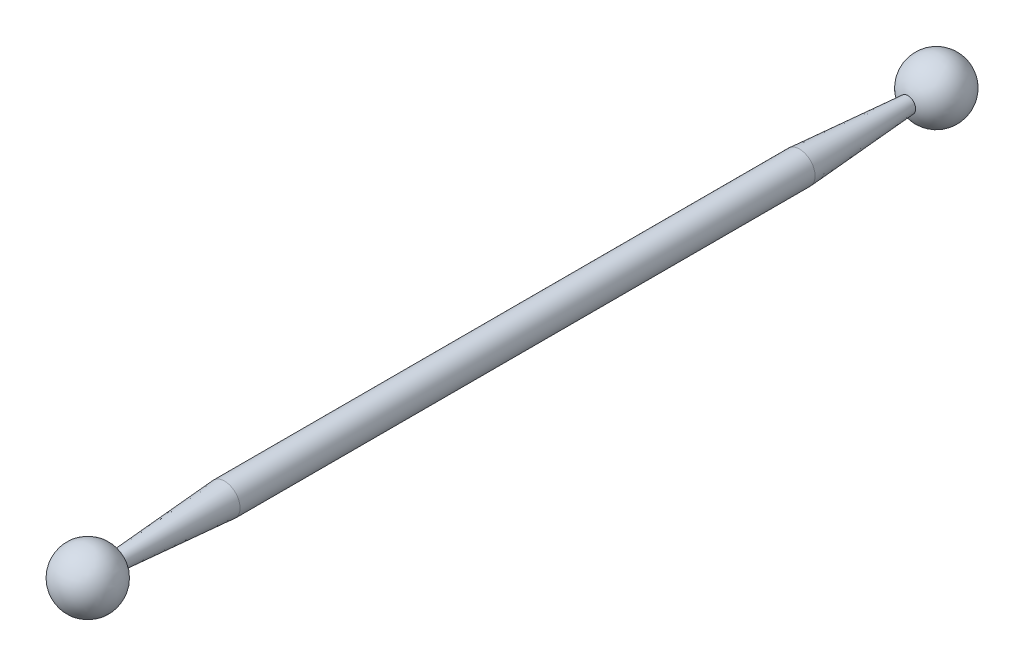
ISO-10303-21;
HEADER;
FILE_DESCRIPTION(('STEP AP214'),'2;1');
FILE_NAME('part.step','',(''),(''),'','','');
FILE_SCHEMA(('AUTOMOTIVE_DESIGN { 1 0 10303 214 1 1 1 1 }'));
ENDSEC;
DATA;
#1=APPLICATION_CONTEXT('core data for automotive mechanical design processes');
#2=APPLICATION_PROTOCOL_DEFINITION('international standard','automotive_design',2000,#1);
#3=PRODUCT_CONTEXT('',#1,'mechanical');
#4=PRODUCT('Part','Part','',(#3));
#5=PRODUCT_RELATED_PRODUCT_CATEGORY('part','',(#4));
#6=PRODUCT_DEFINITION_FORMATION('','',#4);
#7=PRODUCT_DEFINITION_CONTEXT('part definition',#1,'design');
#8=PRODUCT_DEFINITION('design','',#6,#7);
#9=PRODUCT_DEFINITION_SHAPE('','',#8);
#10=(LENGTH_UNIT() NAMED_UNIT(*) SI_UNIT(.MILLI.,.METRE.));
#11=(NAMED_UNIT(*) PLANE_ANGLE_UNIT() SI_UNIT($,.RADIAN.));
#12=(NAMED_UNIT(*) SI_UNIT($,.STERADIAN.) SOLID_ANGLE_UNIT());
#13=UNCERTAINTY_MEASURE_WITH_UNIT(LENGTH_MEASURE(1.E-05),#10,'distance_accuracy_value','');
#14=(GEOMETRIC_REPRESENTATION_CONTEXT(3) GLOBAL_UNCERTAINTY_ASSIGNED_CONTEXT((#13)) GLOBAL_UNIT_ASSIGNED_CONTEXT((#10,
#11,#12)) REPRESENTATION_CONTEXT('',''));
#15=CARTESIAN_POINT('',(0.,0.,0.));
#16=DIRECTION('',(0.,0.,1.));
#17=DIRECTION('',(1.,0.,0.));
#18=AXIS2_PLACEMENT_3D('',#15,#16,#17);
#19=CARTESIAN_POINT('',(0.,0.,44.));
#20=DIRECTION('',(0.,1.,0.));
#21=DIRECTION('',(1.,0.,0.));
#22=AXIS2_PLACEMENT_3D('',#19,#20,#21);
#23=SPHERICAL_SURFACE('',#22,9.5);
#24=CARTESIAN_POINT('',(0.,9.5,44.));
#25=VERTEX_POINT('',#24);
#26=VERTEX_LOOP('',#25);
#27=FACE_BOUND('',#26,.T.);
#28=ADVANCED_FACE('F53',(#27),#23,.T.);
#29=CLOSED_SHELL('',(#28));
#30=MANIFOLD_SOLID_BREP('B2',#29);
#31=CARTESIAN_POINT('',(0.,0.,-220.));
#32=DIRECTION('',(0.,0.,1.));
#33=DIRECTION('',(1.,0.,0.));
#34=AXIS2_PLACEMENT_3D('',#31,#32,#33);
#35=CONICAL_SURFACE('',#34,2.5,0.0713074647852903);
#36=CARTESIAN_POINT('',(0.,0.,-185.));
#37=DIRECTION('',(0.,0.,-1.));
#38=DIRECTION('',(-1.,0.,0.));
#39=AXIS2_PLACEMENT_3D('',#36,#37,#38);
#40=CIRCLE('',#39,5.);
#41=CARTESIAN_POINT('',(-5.,0.,-185.));
#42=VERTEX_POINT('',#41);
#43=EDGE_CURVE('E78',#42,#42,#40,.T.);
#44=ORIENTED_EDGE('',*,*,#43,.T.);
#45=EDGE_LOOP('',(#44));
#46=FACE_BOUND('',#45,.T.);
#47=CARTESIAN_POINT('',(0.,0.,-219.83801258061));
#48=DIRECTION('',(0.,0.,-1.));
#49=DIRECTION('',(-1.,0.,0.));
#50=AXIS2_PLACEMENT_3D('',#47,#48,#49);
#51=CIRCLE('',#50,2.5115705299564);
#52=CARTESIAN_POINT('',(-2.5115705299564,0.,-219.83801258061));
#53=VERTEX_POINT('',#52);
#54=EDGE_CURVE('E73',#53,#53,#51,.F.);
#55=ORIENTED_EDGE('',*,*,#54,.T.);
#56=EDGE_LOOP('',(#55));
#57=FACE_BOUND('',#56,.T.);
#58=ADVANCED_FACE('F68',(#46,#57),#35,.T.);
#59=CARTESIAN_POINT('',(0.,0.,35.));
#60=DIRECTION('',(0.,0.,1.));
#61=DIRECTION('',(1.,0.,0.));
#62=AXIS2_PLACEMENT_3D('',#59,#60,#61);
#63=PLANE('',#62);
#64=CARTESIAN_POINT('',(0.,0.,35.));
#65=DIRECTION('',(0.,0.,1.));
#66=DIRECTION('',(1.,0.,0.));
#67=AXIS2_PLACEMENT_3D('',#64,#65,#66);
#68=CIRCLE('',#67,2.5);
#69=CARTESIAN_POINT('',(2.5,0.,35.));
#70=VERTEX_POINT('',#69);
#71=EDGE_CURVE('E52',#70,#70,#68,.T.);
#72=ORIENTED_EDGE('',*,*,#71,.T.);
#73=EDGE_LOOP('',(#72));
#74=FACE_BOUND('',#73,.T.);
#75=ADVANCED_FACE('F70',(#74),#63,.T.);
#76=CARTESIAN_POINT('',(0.,0.,35.));
#77=DIRECTION('',(0.,0.,-1.));
#78=DIRECTION('',(-1.,0.,0.));
#79=AXIS2_PLACEMENT_3D('',#76,#77,#78);
#80=CONICAL_SURFACE('',#79,2.5,0.0713074647852903);
#81=CARTESIAN_POINT('',(0.,0.,0.));
#82=DIRECTION('',(0.,0.,-1.));
#83=DIRECTION('',(-1.,0.,0.));
#84=AXIS2_PLACEMENT_3D('',#81,#82,#83);
#85=CIRCLE('',#84,5.);
#86=CARTESIAN_POINT('',(-5.,0.,0.));
#87=VERTEX_POINT('',#86);
#88=EDGE_CURVE('E85',#87,#87,#85,.T.);
#89=ORIENTED_EDGE('',*,*,#88,.F.);
#90=EDGE_LOOP('',(#89));
#91=FACE_BOUND('',#90,.T.);
#92=ORIENTED_EDGE('',*,*,#71,.F.);
#93=EDGE_LOOP('',(#92));
#94=FACE_BOUND('',#93,.T.);
#95=ADVANCED_FACE('F111',(#91,#94),#80,.T.);
#96=CARTESIAN_POINT('',(0.,0.,-185.));
#97=DIRECTION('',(0.,0.,1.));
#98=DIRECTION('',(1.,0.,0.));
#99=AXIS2_PLACEMENT_3D('',#96,#97,#98);
#100=CYLINDRICAL_SURFACE('',#99,5.);
#101=ORIENTED_EDGE('',*,*,#43,.F.);
#102=EDGE_LOOP('',(#101));
#103=FACE_BOUND('',#102,.T.);
#104=ORIENTED_EDGE('',*,*,#88,.T.);
#105=EDGE_LOOP('',(#104));
#106=FACE_BOUND('',#105,.T.);
#107=ADVANCED_FACE('F101',(#103,#106),#100,.T.);
#108=CARTESIAN_POINT('',(0.,0.,-229.));
#109=DIRECTION('',(0.,1.,0.));
#110=DIRECTION('',(-1.,0.,0.));
#111=AXIS2_PLACEMENT_3D('',#108,#109,#110);
#112=SPHERICAL_SURFACE('',#111,9.5);
#113=CARTESIAN_POINT('',(0.,0.,-229.));
#114=DIRECTION('',(0.,0.,-1.));
#115=DIRECTION('',(-1.,0.,0.));
#116=AXIS2_PLACEMENT_3D('',#113,#114,#115);
#117=SPHERICAL_SURFACE('',#116,9.5);
#118=ORIENTED_EDGE('',*,*,#54,.F.);
#119=EDGE_LOOP('',(#118));
#120=FACE_BOUND('',#119,.T.);
#121=ADVANCED_FACE('F110',(#120),#117,.T.);
#122=CLOSED_SHELL('',(#58,#75,#95,#107,#121));
#123=MANIFOLD_SOLID_BREP('B7',#122);
#124=ADVANCED_BREP_SHAPE_REPRESENTATION('',(#18,#30,#123),#14);
#125=SHAPE_DEFINITION_REPRESENTATION(#9,#124);
ENDSEC;
END-ISO-10303-21;
